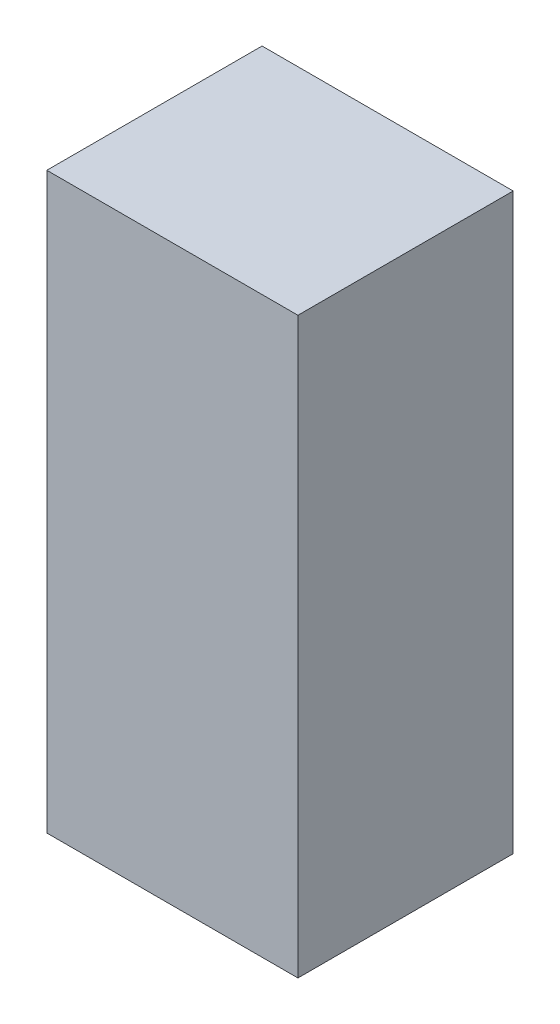
ISO-10303-21;
HEADER;
FILE_DESCRIPTION(('STEP AP214'),'2;1');
FILE_NAME('part.step','',(''),(''),'','','');
FILE_SCHEMA(('AUTOMOTIVE_DESIGN { 1 0 10303 214 1 1 1 1 }'));
ENDSEC;
DATA;
#1=APPLICATION_CONTEXT('core data for automotive mechanical design processes');
#2=APPLICATION_PROTOCOL_DEFINITION('international standard','automotive_design',2000,#1);
#3=PRODUCT_CONTEXT('',#1,'mechanical');
#4=PRODUCT('Part','Part','',(#3));
#5=PRODUCT_RELATED_PRODUCT_CATEGORY('part','',(#4));
#6=PRODUCT_DEFINITION_FORMATION('','',#4);
#7=PRODUCT_DEFINITION_CONTEXT('part definition',#1,'design');
#8=PRODUCT_DEFINITION('design','',#6,#7);
#9=PRODUCT_DEFINITION_SHAPE('','',#8);
#10=(LENGTH_UNIT() NAMED_UNIT(*) SI_UNIT(.MILLI.,.METRE.));
#11=(NAMED_UNIT(*) PLANE_ANGLE_UNIT() SI_UNIT($,.RADIAN.));
#12=(NAMED_UNIT(*) SI_UNIT($,.STERADIAN.) SOLID_ANGLE_UNIT());
#13=UNCERTAINTY_MEASURE_WITH_UNIT(LENGTH_MEASURE(1.E-05),#10,'distance_accuracy_value','');
#14=(GEOMETRIC_REPRESENTATION_CONTEXT(3) GLOBAL_UNCERTAINTY_ASSIGNED_CONTEXT((#13)) GLOBAL_UNIT_ASSIGNED_CONTEXT((#10,
#11,#12)) REPRESENTATION_CONTEXT('',''));
#15=CARTESIAN_POINT('',(0.,0.,0.));
#16=DIRECTION('',(0.,0.,1.));
#17=DIRECTION('',(1.,0.,0.));
#18=AXIS2_PLACEMENT_3D('',#15,#16,#17);
#19=CARTESIAN_POINT('',(1.75,8.,-1.5));
#20=DIRECTION('',(-1.,0.,0.));
#21=DIRECTION('',(0.,0.,1.));
#22=AXIS2_PLACEMENT_3D('',#19,#20,#21);
#23=PLANE('',#22);
#24=DIRECTION('',(0.,0.,-1.));
#25=VECTOR('',#24,1.);
#26=CARTESIAN_POINT('',(1.75,0.,-1.5));
#27=LINE('',#26,#25);
#28=CARTESIAN_POINT('',(1.75,0.,1.5));
#29=VERTEX_POINT('',#28);
#30=CARTESIAN_POINT('',(1.75,0.,-1.5));
#31=VERTEX_POINT('',#30);
#32=EDGE_CURVE('E96',#29,#31,#27,.T.);
#33=ORIENTED_EDGE('',*,*,#32,.T.);
#34=DIRECTION('',(0.,-1.,0.));
#35=VECTOR('',#34,1.);
#36=CARTESIAN_POINT('',(1.75,8.,-1.5));
#37=LINE('',#36,#35);
#38=CARTESIAN_POINT('',(1.75,8.,-1.5));
#39=VERTEX_POINT('',#38);
#40=EDGE_CURVE('E11',#39,#31,#37,.T.);
#41=ORIENTED_EDGE('',*,*,#40,.F.);
#42=DIRECTION('',(0.,0.,-1.));
#43=VECTOR('',#42,1.);
#44=CARTESIAN_POINT('',(1.75,8.,-1.5));
#45=LINE('',#44,#43);
#46=CARTESIAN_POINT('',(1.75,8.,1.5));
#47=VERTEX_POINT('',#46);
#48=EDGE_CURVE('E84',#47,#39,#45,.T.);
#49=ORIENTED_EDGE('',*,*,#48,.F.);
#50=DIRECTION('',(0.,-1.,0.));
#51=VECTOR('',#50,1.);
#52=CARTESIAN_POINT('',(1.75,8.,1.5));
#53=LINE('',#52,#51);
#54=EDGE_CURVE('E92',#47,#29,#53,.T.);
#55=ORIENTED_EDGE('',*,*,#54,.T.);
#56=EDGE_LOOP('',(#33,#41,#49,#55));
#57=FACE_BOUND('',#56,.T.);
#58=ADVANCED_FACE('F33',(#57),#23,.F.);
#59=CARTESIAN_POINT('',(-1.75,8.,-1.5));
#60=DIRECTION('',(0.,0.,1.));
#61=DIRECTION('',(1.,0.,0.));
#62=AXIS2_PLACEMENT_3D('',#59,#60,#61);
#63=PLANE('',#62);
#64=DIRECTION('',(-1.,0.,0.));
#65=VECTOR('',#64,1.);
#66=CARTESIAN_POINT('',(-1.75,0.,-1.5));
#67=LINE('',#66,#65);
#68=CARTESIAN_POINT('',(-1.75,0.,-1.5));
#69=VERTEX_POINT('',#68);
#70=EDGE_CURVE('E88',#31,#69,#67,.T.);
#71=ORIENTED_EDGE('',*,*,#70,.T.);
#72=DIRECTION('',(0.,-1.,0.));
#73=VECTOR('',#72,1.);
#74=CARTESIAN_POINT('',(-1.75,8.,-1.5));
#75=LINE('',#74,#73);
#76=CARTESIAN_POINT('',(-1.75,8.,-1.5));
#77=VERTEX_POINT('',#76);
#78=EDGE_CURVE('E41',#77,#69,#75,.T.);
#79=ORIENTED_EDGE('',*,*,#78,.F.);
#80=DIRECTION('',(-1.,0.,0.));
#81=VECTOR('',#80,1.);
#82=CARTESIAN_POINT('',(-1.75,8.,-1.5));
#83=LINE('',#82,#81);
#84=EDGE_CURVE('E79',#39,#77,#83,.T.);
#85=ORIENTED_EDGE('',*,*,#84,.F.);
#86=ORIENTED_EDGE('',*,*,#40,.T.);
#87=EDGE_LOOP('',(#71,#79,#85,#86));
#88=FACE_BOUND('',#87,.T.);
#89=ADVANCED_FACE('F87',(#88),#63,.F.);
#90=CARTESIAN_POINT('',(-1.75,8.,-1.5));
#91=DIRECTION('',(1.,0.,0.));
#92=DIRECTION('',(0.,0.,-1.));
#93=AXIS2_PLACEMENT_3D('',#90,#91,#92);
#94=PLANE('',#93);
#95=DIRECTION('',(0.,0.,1.));
#96=VECTOR('',#95,1.);
#97=CARTESIAN_POINT('',(-1.75,0.,-1.5));
#98=LINE('',#97,#96);
#99=CARTESIAN_POINT('',(-1.75,0.,1.5));
#100=VERTEX_POINT('',#99);
#101=EDGE_CURVE('E66',#69,#100,#98,.T.);
#102=ORIENTED_EDGE('',*,*,#101,.T.);
#103=DIRECTION('',(0.,-1.,0.));
#104=VECTOR('',#103,1.);
#105=CARTESIAN_POINT('',(-1.75,8.,1.5));
#106=LINE('',#105,#104);
#107=CARTESIAN_POINT('',(-1.75,8.,1.5));
#108=VERTEX_POINT('',#107);
#109=EDGE_CURVE('E89',#108,#100,#106,.T.);
#110=ORIENTED_EDGE('',*,*,#109,.F.);
#111=DIRECTION('',(0.,0.,1.));
#112=VECTOR('',#111,1.);
#113=CARTESIAN_POINT('',(-1.75,8.,-1.5));
#114=LINE('',#113,#112);
#115=EDGE_CURVE('E82',#77,#108,#114,.T.);
#116=ORIENTED_EDGE('',*,*,#115,.F.);
#117=ORIENTED_EDGE('',*,*,#78,.T.);
#118=EDGE_LOOP('',(#102,#110,#116,#117));
#119=FACE_BOUND('',#118,.T.);
#120=ADVANCED_FACE('F90',(#119),#94,.F.);
#121=CARTESIAN_POINT('',(-1.75,8.,1.5));
#122=DIRECTION('',(0.,0.,-1.));
#123=DIRECTION('',(-1.,0.,0.));
#124=AXIS2_PLACEMENT_3D('',#121,#122,#123);
#125=PLANE('',#124);
#126=DIRECTION('',(1.,0.,0.));
#127=VECTOR('',#126,1.);
#128=CARTESIAN_POINT('',(-1.75,0.,1.5));
#129=LINE('',#128,#127);
#130=EDGE_CURVE('E72',#100,#29,#129,.T.);
#131=ORIENTED_EDGE('',*,*,#130,.T.);
#132=ORIENTED_EDGE('',*,*,#54,.F.);
#133=DIRECTION('',(1.,0.,0.));
#134=VECTOR('',#133,1.);
#135=CARTESIAN_POINT('',(-1.75,8.,1.5));
#136=LINE('',#135,#134);
#137=EDGE_CURVE('E49',#108,#47,#136,.T.);
#138=ORIENTED_EDGE('',*,*,#137,.F.);
#139=ORIENTED_EDGE('',*,*,#109,.T.);
#140=EDGE_LOOP('',(#131,#132,#138,#139));
#141=FACE_BOUND('',#140,.T.);
#142=ADVANCED_FACE('F103',(#141),#125,.F.);
#143=CARTESIAN_POINT('',(0.,8.,0.));
#144=DIRECTION('',(0.,1.,0.));
#145=DIRECTION('',(0.,0.,1.));
#146=AXIS2_PLACEMENT_3D('',#143,#144,#145);
#147=PLANE('',#146);
#148=ORIENTED_EDGE('',*,*,#48,.T.);
#149=ORIENTED_EDGE('',*,*,#84,.T.);
#150=ORIENTED_EDGE('',*,*,#115,.T.);
#151=ORIENTED_EDGE('',*,*,#137,.T.);
#152=EDGE_LOOP('',(#148,#149,#150,#151));
#153=FACE_BOUND('',#152,.T.);
#154=ADVANCED_FACE('F80',(#153),#147,.T.);
#155=CARTESIAN_POINT('',(0.,0.,0.));
#156=DIRECTION('',(0.,1.,0.));
#157=DIRECTION('',(0.,0.,1.));
#158=AXIS2_PLACEMENT_3D('',#155,#156,#157);
#159=PLANE('',#158);
#160=ORIENTED_EDGE('',*,*,#32,.F.);
#161=ORIENTED_EDGE('',*,*,#130,.F.);
#162=ORIENTED_EDGE('',*,*,#101,.F.);
#163=ORIENTED_EDGE('',*,*,#70,.F.);
#164=EDGE_LOOP('',(#160,#161,#162,#163));
#165=FACE_BOUND('',#164,.T.);
#166=ADVANCED_FACE('F106',(#165),#159,.F.);
#167=CLOSED_SHELL('',(#58,#89,#120,#142,#154,#166));
#168=MANIFOLD_SOLID_BREP('B2',#167);
#169=ADVANCED_BREP_SHAPE_REPRESENTATION('',(#18,#168),#14);
#170=SHAPE_DEFINITION_REPRESENTATION(#9,#169);
ENDSEC;
END-ISO-10303-21;
